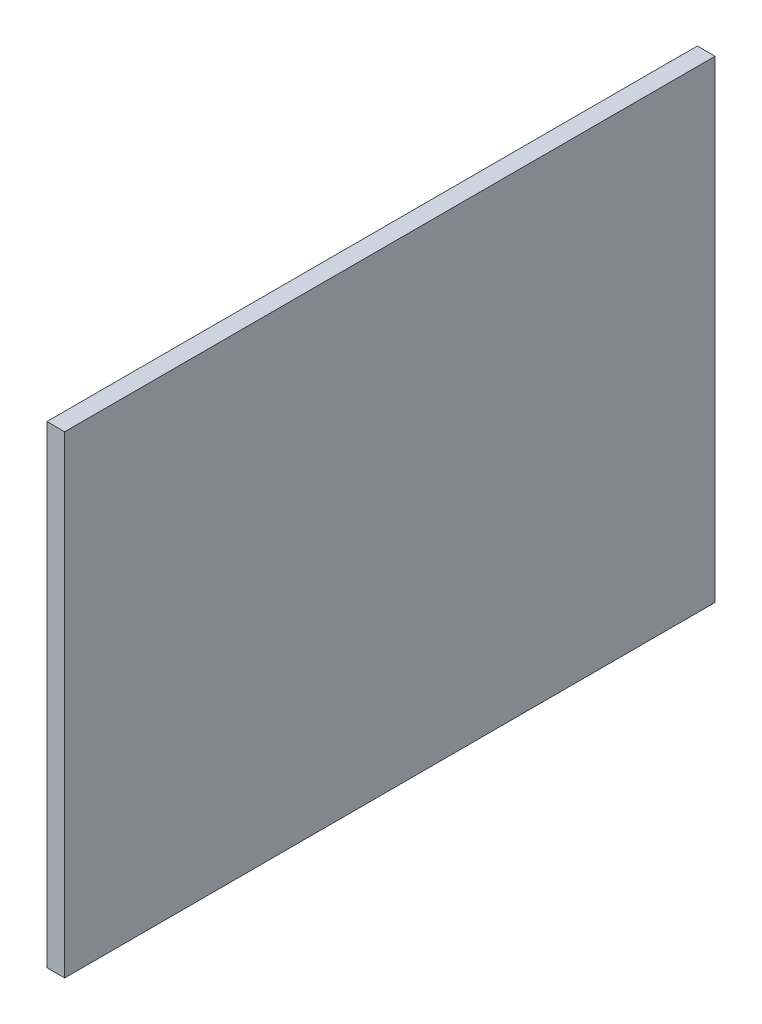
ISO-10303-21;
HEADER;
FILE_DESCRIPTION(('STEP AP214'),'2;1');
FILE_NAME('part.step','',(''),(''),'','','');
FILE_SCHEMA(('AUTOMOTIVE_DESIGN { 1 0 10303 214 1 1 1 1 }'));
ENDSEC;
DATA;
#1=APPLICATION_CONTEXT('core data for automotive mechanical design processes');
#2=APPLICATION_PROTOCOL_DEFINITION('international standard','automotive_design',2000,#1);
#3=PRODUCT_CONTEXT('',#1,'mechanical');
#4=PRODUCT('Part','Part','',(#3));
#5=PRODUCT_RELATED_PRODUCT_CATEGORY('part','',(#4));
#6=PRODUCT_DEFINITION_FORMATION('','',#4);
#7=PRODUCT_DEFINITION_CONTEXT('part definition',#1,'design');
#8=PRODUCT_DEFINITION('design','',#6,#7);
#9=PRODUCT_DEFINITION_SHAPE('','',#8);
#10=(LENGTH_UNIT() NAMED_UNIT(*) SI_UNIT(.MILLI.,.METRE.));
#11=(NAMED_UNIT(*) PLANE_ANGLE_UNIT() SI_UNIT($,.RADIAN.));
#12=(NAMED_UNIT(*) SI_UNIT($,.STERADIAN.) SOLID_ANGLE_UNIT());
#13=UNCERTAINTY_MEASURE_WITH_UNIT(LENGTH_MEASURE(1.E-05),#10,'distance_accuracy_value','');
#14=(GEOMETRIC_REPRESENTATION_CONTEXT(3) GLOBAL_UNCERTAINTY_ASSIGNED_CONTEXT((#13)) GLOBAL_UNIT_ASSIGNED_CONTEXT((#10,
#11,#12)) REPRESENTATION_CONTEXT('',''));
#15=CARTESIAN_POINT('',(0.,0.,0.));
#16=DIRECTION('',(0.,0.,1.));
#17=DIRECTION('',(1.,0.,0.));
#18=AXIS2_PLACEMENT_3D('',#15,#16,#17);
#19=CARTESIAN_POINT('',(3.,-62.7764987520194,36.2025316455696));
#20=DIRECTION('',(0.,1.,0.));
#21=DIRECTION('',(0.,0.,1.));
#22=AXIS2_PLACEMENT_3D('',#19,#20,#21);
#23=PLANE('',#22);
#24=DIRECTION('',(0.,0.,-1.));
#25=VECTOR('',#24,1.);
#26=CARTESIAN_POINT('',(0.,-62.7764987520194,36.2025316455696));
#27=LINE('',#26,#25);
#28=CARTESIAN_POINT('',(0.,-62.7764987520194,36.2025316455696));
#29=VERTEX_POINT('',#28);
#30=CARTESIAN_POINT('',(0.,-62.7764987520194,-73.7974683544304));
#31=VERTEX_POINT('',#30);
#32=EDGE_CURVE('E95',#29,#31,#27,.T.);
#33=ORIENTED_EDGE('',*,*,#32,.T.);
#34=DIRECTION('',(-1.,0.,0.));
#35=VECTOR('',#34,1.);
#36=CARTESIAN_POINT('',(3.,-62.7764987520194,-73.7974683544304));
#37=LINE('',#36,#35);
#38=CARTESIAN_POINT('',(3.,-62.7764987520194,-73.7974683544304));
#39=VERTEX_POINT('',#38);
#40=EDGE_CURVE('E11',#39,#31,#37,.T.);
#41=ORIENTED_EDGE('',*,*,#40,.F.);
#42=DIRECTION('',(0.,0.,-1.));
#43=VECTOR('',#42,1.);
#44=CARTESIAN_POINT('',(3.,-62.7764987520194,36.2025316455696));
#45=LINE('',#44,#43);
#46=CARTESIAN_POINT('',(3.,-62.7764987520194,36.2025316455696));
#47=VERTEX_POINT('',#46);
#48=EDGE_CURVE('E72',#47,#39,#45,.T.);
#49=ORIENTED_EDGE('',*,*,#48,.F.);
#50=DIRECTION('',(-1.,0.,0.));
#51=VECTOR('',#50,1.);
#52=CARTESIAN_POINT('',(3.,-62.7764987520194,36.2025316455696));
#53=LINE('',#52,#51);
#54=EDGE_CURVE('E91',#47,#29,#53,.T.);
#55=ORIENTED_EDGE('',*,*,#54,.T.);
#56=EDGE_LOOP('',(#33,#41,#49,#55));
#57=FACE_BOUND('',#56,.T.);
#58=ADVANCED_FACE('F33',(#57),#23,.F.);
#59=CARTESIAN_POINT('',(3.,17.2235012479806,-73.7974683544304));
#60=DIRECTION('',(0.,0.,-1.));
#61=DIRECTION('',(0.,1.,0.));
#62=AXIS2_PLACEMENT_3D('',#59,#60,#61);
#63=PLANE('',#62);
#64=DIRECTION('',(0.,-1.,0.));
#65=VECTOR('',#64,1.);
#66=CARTESIAN_POINT('',(0.,17.2235012479806,-73.7974683544304));
#67=LINE('',#66,#65);
#68=CARTESIAN_POINT('',(0.,17.2235012479806,-73.7974683544304));
#69=VERTEX_POINT('',#68);
#70=EDGE_CURVE('E81',#69,#31,#67,.T.);
#71=ORIENTED_EDGE('',*,*,#70,.F.);
#72=DIRECTION('',(-1.,0.,0.));
#73=VECTOR('',#72,1.);
#74=CARTESIAN_POINT('',(3.,17.2235012479806,-73.7974683544304));
#75=LINE('',#74,#73);
#76=CARTESIAN_POINT('',(3.,17.2235012479806,-73.7974683544304));
#77=VERTEX_POINT('',#76);
#78=EDGE_CURVE('E41',#77,#69,#75,.T.);
#79=ORIENTED_EDGE('',*,*,#78,.F.);
#80=DIRECTION('',(0.,-1.,0.));
#81=VECTOR('',#80,1.);
#82=CARTESIAN_POINT('',(3.,17.2235012479806,-73.7974683544304));
#83=LINE('',#82,#81);
#84=EDGE_CURVE('E79',#77,#39,#83,.T.);
#85=ORIENTED_EDGE('',*,*,#84,.T.);
#86=ORIENTED_EDGE('',*,*,#40,.T.);
#87=EDGE_LOOP('',(#71,#79,#85,#86));
#88=FACE_BOUND('',#87,.T.);
#89=ADVANCED_FACE('F78',(#88),#63,.T.);
#90=CARTESIAN_POINT('',(3.,17.2235012479806,36.2025316455696));
#91=DIRECTION('',(0.,1.,0.));
#92=DIRECTION('',(0.,0.,1.));
#93=AXIS2_PLACEMENT_3D('',#90,#91,#92);
#94=PLANE('',#93);
#95=DIRECTION('',(0.,0.,-1.));
#96=VECTOR('',#95,1.);
#97=CARTESIAN_POINT('',(0.,17.2235012479806,36.2025316455696));
#98=LINE('',#97,#96);
#99=CARTESIAN_POINT('',(0.,17.2235012479806,36.2025316455696));
#100=VERTEX_POINT('',#99);
#101=EDGE_CURVE('E99',#100,#69,#98,.T.);
#102=ORIENTED_EDGE('',*,*,#101,.F.);
#103=DIRECTION('',(-1.,0.,0.));
#104=VECTOR('',#103,1.);
#105=CARTESIAN_POINT('',(3.,17.2235012479806,36.2025316455696));
#106=LINE('',#105,#104);
#107=CARTESIAN_POINT('',(3.,17.2235012479806,36.2025316455696));
#108=VERTEX_POINT('',#107);
#109=EDGE_CURVE('E64',#108,#100,#106,.T.);
#110=ORIENTED_EDGE('',*,*,#109,.F.);
#111=DIRECTION('',(0.,0.,-1.));
#112=VECTOR('',#111,1.);
#113=CARTESIAN_POINT('',(3.,17.2235012479806,36.2025316455696));
#114=LINE('',#113,#112);
#115=EDGE_CURVE('E87',#108,#77,#114,.T.);
#116=ORIENTED_EDGE('',*,*,#115,.T.);
#117=ORIENTED_EDGE('',*,*,#78,.T.);
#118=EDGE_LOOP('',(#102,#110,#116,#117));
#119=FACE_BOUND('',#118,.T.);
#120=ADVANCED_FACE('F89',(#119),#94,.T.);
#121=CARTESIAN_POINT('',(3.,17.2235012479806,36.2025316455696));
#122=DIRECTION('',(0.,0.,-1.));
#123=DIRECTION('',(0.,1.,0.));
#124=AXIS2_PLACEMENT_3D('',#121,#122,#123);
#125=PLANE('',#124);
#126=DIRECTION('',(0.,-1.,0.));
#127=VECTOR('',#126,1.);
#128=CARTESIAN_POINT('',(0.,17.2235012479806,36.2025316455696));
#129=LINE('',#128,#127);
#130=EDGE_CURVE('E67',#100,#29,#129,.T.);
#131=ORIENTED_EDGE('',*,*,#130,.T.);
#132=ORIENTED_EDGE('',*,*,#54,.F.);
#133=DIRECTION('',(0.,-1.,0.));
#134=VECTOR('',#133,1.);
#135=CARTESIAN_POINT('',(3.,17.2235012479806,36.2025316455696));
#136=LINE('',#135,#134);
#137=EDGE_CURVE('E49',#108,#47,#136,.T.);
#138=ORIENTED_EDGE('',*,*,#137,.F.);
#139=ORIENTED_EDGE('',*,*,#109,.T.);
#140=EDGE_LOOP('',(#131,#132,#138,#139));
#141=FACE_BOUND('',#140,.T.);
#142=ADVANCED_FACE('F112',(#141),#125,.F.);
#143=CARTESIAN_POINT('',(3.,0.,0.));
#144=DIRECTION('',(-1.,0.,0.));
#145=DIRECTION('',(0.,0.,1.));
#146=AXIS2_PLACEMENT_3D('',#143,#144,#145);
#147=PLANE('',#146);
#148=ORIENTED_EDGE('',*,*,#48,.T.);
#149=ORIENTED_EDGE('',*,*,#84,.F.);
#150=ORIENTED_EDGE('',*,*,#115,.F.);
#151=ORIENTED_EDGE('',*,*,#137,.T.);
#152=EDGE_LOOP('',(#148,#149,#150,#151));
#153=FACE_BOUND('',#152,.T.);
#154=ADVANCED_FACE('F86',(#153),#147,.F.);
#155=CARTESIAN_POINT('',(0.,0.,0.));
#156=DIRECTION('',(-1.,0.,0.));
#157=DIRECTION('',(0.,0.,1.));
#158=AXIS2_PLACEMENT_3D('',#155,#156,#157);
#159=PLANE('',#158);
#160=ORIENTED_EDGE('',*,*,#32,.F.);
#161=ORIENTED_EDGE('',*,*,#130,.F.);
#162=ORIENTED_EDGE('',*,*,#101,.T.);
#163=ORIENTED_EDGE('',*,*,#70,.T.);
#164=EDGE_LOOP('',(#160,#161,#162,#163));
#165=FACE_BOUND('',#164,.T.);
#166=ADVANCED_FACE('F106',(#165),#159,.T.);
#167=CLOSED_SHELL('',(#58,#89,#120,#142,#154,#166));
#168=MANIFOLD_SOLID_BREP('B2',#167);
#169=ADVANCED_BREP_SHAPE_REPRESENTATION('',(#18,#168),#14);
#170=SHAPE_DEFINITION_REPRESENTATION(#9,#169);
ENDSEC;
END-ISO-10303-21;
